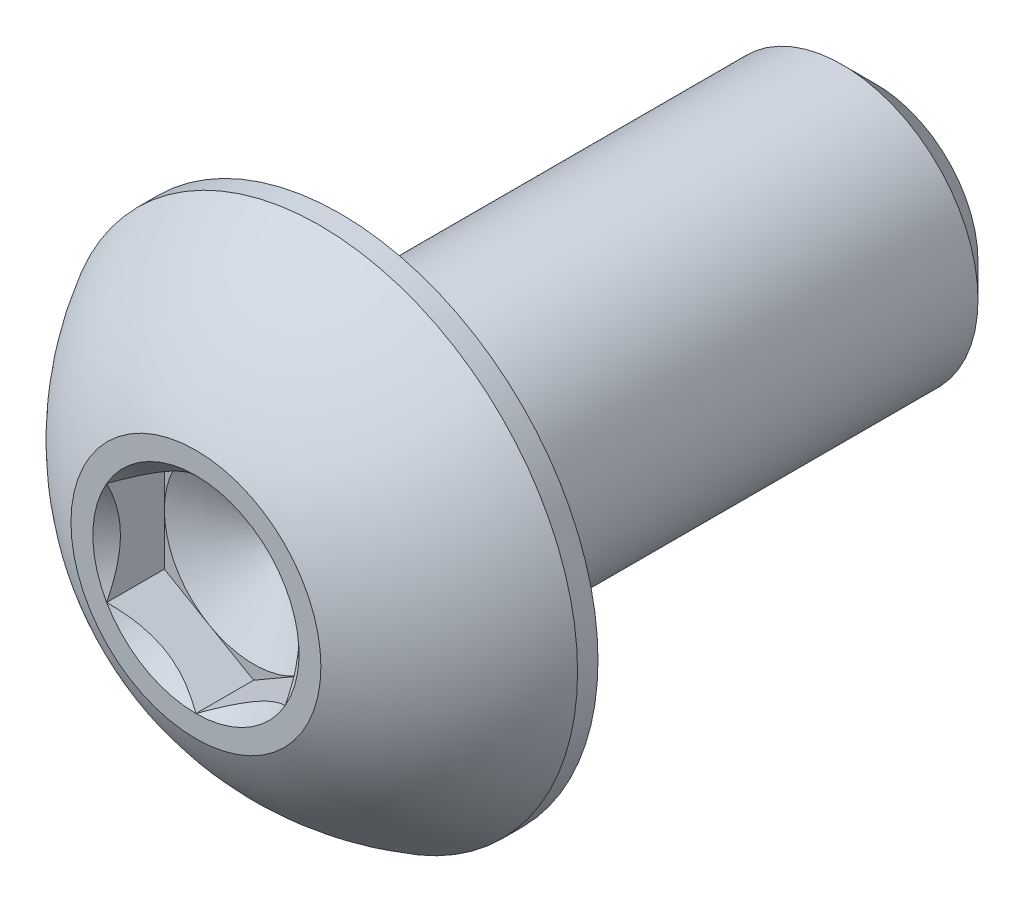
ISO-10303-21;
HEADER;
FILE_DESCRIPTION(('STEP AP214'),'2;1');
FILE_NAME('part.step','',(''),(''),'','','');
FILE_SCHEMA(('AUTOMOTIVE_DESIGN { 1 0 10303 214 1 1 1 1 }'));
ENDSEC;
DATA;
#1=APPLICATION_CONTEXT('core data for automotive mechanical design processes');
#2=APPLICATION_PROTOCOL_DEFINITION('international standard','automotive_design',2000,#1);
#3=PRODUCT_CONTEXT('',#1,'mechanical');
#4=PRODUCT('Part','Part','',(#3));
#5=PRODUCT_RELATED_PRODUCT_CATEGORY('part','',(#4));
#6=PRODUCT_DEFINITION_FORMATION('','',#4);
#7=PRODUCT_DEFINITION_CONTEXT('part definition',#1,'design');
#8=PRODUCT_DEFINITION('design','',#6,#7);
#9=PRODUCT_DEFINITION_SHAPE('','',#8);
#10=(LENGTH_UNIT() NAMED_UNIT(*) SI_UNIT(.MILLI.,.METRE.));
#11=(NAMED_UNIT(*) PLANE_ANGLE_UNIT() SI_UNIT($,.RADIAN.));
#12=(NAMED_UNIT(*) SI_UNIT($,.STERADIAN.) SOLID_ANGLE_UNIT());
#13=UNCERTAINTY_MEASURE_WITH_UNIT(LENGTH_MEASURE(1.E-05),#10,'distance_accuracy_value','');
#14=(GEOMETRIC_REPRESENTATION_CONTEXT(3) GLOBAL_UNCERTAINTY_ASSIGNED_CONTEXT((#13)) GLOBAL_UNIT_ASSIGNED_CONTEXT((#10,
#11,#12)) REPRESENTATION_CONTEXT('',''));
#15=CARTESIAN_POINT('',(0.,0.,0.));
#16=DIRECTION('',(0.,0.,1.));
#17=DIRECTION('',(1.,0.,0.));
#18=AXIS2_PLACEMENT_3D('',#15,#16,#17);
#19=CARTESIAN_POINT('',(0.,1.5875,6.0452));
#20=DIRECTION('',(0.,0.,-1.));
#21=DIRECTION('',(-1.,0.,0.));
#22=AXIS2_PLACEMENT_3D('',#19,#20,#21);
#23=PLANE('',#22);
#24=CARTESIAN_POINT('',(0.,0.,6.0452));
#25=DIRECTION('',(0.,0.,1.));
#26=DIRECTION('',(1.,0.,0.));
#27=AXIS2_PLACEMENT_3D('',#24,#25,#26);
#28=CIRCLE('',#27,2.2225);
#29=CARTESIAN_POINT('',(0.,2.2225,6.0452));
#30=VERTEX_POINT('',#29);
#31=EDGE_CURVE('E167',#30,#30,#28,.T.);
#32=ORIENTED_EDGE('',*,*,#31,.T.);
#33=EDGE_LOOP('',(#32));
#34=FACE_BOUND('',#33,.T.);
#35=CARTESIAN_POINT('',(0.,0.,6.0452));
#36=DIRECTION('',(0.,0.,1.));
#37=DIRECTION('',(1.,0.,0.));
#38=AXIS2_PLACEMENT_3D('',#35,#36,#37);
#39=CIRCLE('',#38,1.83308710467706);
#40=CARTESIAN_POINT('',(0.,1.83308710467706,6.0452));
#41=VERTEX_POINT('',#40);
#42=CARTESIAN_POINT('',(-1.5875,0.91654355233853,6.0452));
#43=VERTEX_POINT('',#42);
#44=EDGE_CURVE('E121',#41,#43,#39,.T.);
#45=ORIENTED_EDGE('',*,*,#44,.F.);
#46=CARTESIAN_POINT('',(0.,0.,6.0452));
#47=DIRECTION('',(0.,0.,1.));
#48=DIRECTION('',(1.,0.,0.));
#49=AXIS2_PLACEMENT_3D('',#46,#47,#48);
#50=CIRCLE('',#49,1.83308710467706);
#51=CARTESIAN_POINT('',(1.5875,0.916543552338531,6.0452));
#52=VERTEX_POINT('',#51);
#53=EDGE_CURVE('E106',#52,#41,#50,.T.);
#54=ORIENTED_EDGE('',*,*,#53,.F.);
#55=CARTESIAN_POINT('',(0.,0.,6.0452));
#56=DIRECTION('',(0.,0.,1.));
#57=DIRECTION('',(1.,0.,0.));
#58=AXIS2_PLACEMENT_3D('',#55,#56,#57);
#59=CIRCLE('',#58,1.83308710467706);
#60=CARTESIAN_POINT('',(1.5875,-0.916543552338529,6.0452));
#61=VERTEX_POINT('',#60);
#62=EDGE_CURVE('E117',#61,#52,#59,.T.);
#63=ORIENTED_EDGE('',*,*,#62,.F.);
#64=CARTESIAN_POINT('',(0.,0.,6.0452));
#65=DIRECTION('',(0.,0.,1.));
#66=DIRECTION('',(1.,0.,0.));
#67=AXIS2_PLACEMENT_3D('',#64,#65,#66);
#68=CIRCLE('',#67,1.83308710467706);
#69=CARTESIAN_POINT('',(0.,-1.83308710467706,6.0452));
#70=VERTEX_POINT('',#69);
#71=EDGE_CURVE('E138',#70,#61,#68,.T.);
#72=ORIENTED_EDGE('',*,*,#71,.F.);
#73=CARTESIAN_POINT('',(0.,0.,6.0452));
#74=DIRECTION('',(0.,0.,1.));
#75=DIRECTION('',(1.,0.,0.));
#76=AXIS2_PLACEMENT_3D('',#73,#74,#75);
#77=CIRCLE('',#76,1.83308710467706);
#78=CARTESIAN_POINT('',(-1.5875,-0.916543552338533,6.0452));
#79=VERTEX_POINT('',#78);
#80=EDGE_CURVE('E438',#79,#70,#77,.T.);
#81=ORIENTED_EDGE('',*,*,#80,.F.);
#82=CARTESIAN_POINT('',(0.,0.,6.0452));
#83=DIRECTION('',(0.,0.,1.));
#84=DIRECTION('',(1.,0.,0.));
#85=AXIS2_PLACEMENT_3D('',#82,#83,#84);
#86=CIRCLE('',#85,1.83308710467706);
#87=EDGE_CURVE('E447',#43,#79,#86,.T.);
#88=ORIENTED_EDGE('',*,*,#87,.F.);
#89=EDGE_LOOP('',(#45,#54,#63,#72,#81,#88));
#90=FACE_BOUND('',#89,.T.);
#91=ADVANCED_FACE('F33',(#34,#90),#23,.F.);
#92=CARTESIAN_POINT('',(0.,0.,-6.0452));
#93=DIRECTION('',(0.,0.,1.));
#94=DIRECTION('',(1.,0.,0.));
#95=AXIS2_PLACEMENT_3D('',#92,#93,#94);
#96=CONICAL_SURFACE('',#95,1.8176875,0.785398163397447);
#97=CARTESIAN_POINT('',(0.,0.,-5.4498875));
#98=DIRECTION('',(0.,0.,1.));
#99=DIRECTION('',(1.,0.,0.));
#100=AXIS2_PLACEMENT_3D('',#97,#98,#99);
#101=CIRCLE('',#100,2.413);
#102=CARTESIAN_POINT('',(2.413,0.,-5.4498875));
#103=VERTEX_POINT('',#102);
#104=EDGE_CURVE('E11',#103,#103,#101,.T.);
#105=ORIENTED_EDGE('',*,*,#104,.F.);
#106=EDGE_LOOP('',(#105));
#107=FACE_BOUND('',#106,.T.);
#108=CARTESIAN_POINT('',(0.,0.,-6.0452));
#109=DIRECTION('',(0.,0.,1.));
#110=DIRECTION('',(1.,0.,0.));
#111=AXIS2_PLACEMENT_3D('',#108,#109,#110);
#112=CIRCLE('',#111,1.8176875);
#113=CARTESIAN_POINT('',(1.8176875,0.,-6.0452));
#114=VERTEX_POINT('',#113);
#115=EDGE_CURVE('E160',#114,#114,#112,.T.);
#116=ORIENTED_EDGE('',*,*,#115,.T.);
#117=EDGE_LOOP('',(#116));
#118=FACE_BOUND('',#117,.T.);
#119=ADVANCED_FACE('F35',(#107,#118),#96,.T.);
#120=CARTESIAN_POINT('',(0.,0.,6.0452));
#121=DIRECTION('',(0.,0.,1.));
#122=DIRECTION('',(1.,0.,0.));
#123=AXIS2_PLACEMENT_3D('',#120,#121,#122);
#124=CYLINDRICAL_SURFACE('',#123,2.413);
#125=CARTESIAN_POINT('',(0.,0.,3.4798));
#126=DIRECTION('',(0.,0.,1.));
#127=DIRECTION('',(1.,0.,0.));
#128=AXIS2_PLACEMENT_3D('',#125,#126,#127);
#129=CIRCLE('',#128,2.413);
#130=CARTESIAN_POINT('',(2.413,0.,3.4798));
#131=VERTEX_POINT('',#130);
#132=EDGE_CURVE('E41',#131,#131,#129,.T.);
#133=ORIENTED_EDGE('',*,*,#132,.F.);
#134=EDGE_LOOP('',(#133));
#135=FACE_BOUND('',#134,.T.);
#136=ORIENTED_EDGE('',*,*,#104,.T.);
#137=EDGE_LOOP('',(#136));
#138=FACE_BOUND('',#137,.T.);
#139=ADVANCED_FACE('F181',(#135,#138),#124,.T.);
#140=CARTESIAN_POINT('',(0.,4.5847,3.4798));
#141=DIRECTION('',(0.,0.,1.));
#142=DIRECTION('',(1.,0.,0.));
#143=AXIS2_PLACEMENT_3D('',#140,#141,#142);
#144=PLANE('',#143);
#145=CARTESIAN_POINT('',(0.,0.,3.4798));
#146=DIRECTION('',(0.,0.,1.));
#147=DIRECTION('',(1.,0.,0.));
#148=AXIS2_PLACEMENT_3D('',#145,#146,#147);
#149=CIRCLE('',#148,4.5847);
#150=CARTESIAN_POINT('',(4.5847,0.,3.4798));
#151=VERTEX_POINT('',#150);
#152=EDGE_CURVE('E174',#151,#151,#149,.T.);
#153=ORIENTED_EDGE('',*,*,#152,.F.);
#154=EDGE_LOOP('',(#153));
#155=FACE_BOUND('',#154,.T.);
#156=ORIENTED_EDGE('',*,*,#132,.T.);
#157=EDGE_LOOP('',(#156));
#158=FACE_BOUND('',#157,.T.);
#159=ADVANCED_FACE('F179',(#155,#158),#144,.F.);
#160=CARTESIAN_POINT('',(0.,0.,6.0452));
#161=DIRECTION('',(0.,0.,1.));
#162=DIRECTION('',(1.,0.,0.));
#163=AXIS2_PLACEMENT_3D('',#160,#161,#162);
#164=CYLINDRICAL_SURFACE('',#163,4.5847);
#165=CARTESIAN_POINT('',(0.,0.,3.84265714285714));
#166=DIRECTION('',(0.,0.,1.));
#167=DIRECTION('',(1.,0.,0.));
#168=AXIS2_PLACEMENT_3D('',#165,#166,#167);
#169=CIRCLE('',#168,4.5847);
#170=CARTESIAN_POINT('',(0.,4.5847,3.84265714285714));
#171=VERTEX_POINT('',#170);
#172=EDGE_CURVE('E171',#171,#171,#169,.T.);
#173=ORIENTED_EDGE('',*,*,#172,.F.);
#174=EDGE_LOOP('',(#173));
#175=FACE_BOUND('',#174,.T.);
#176=ORIENTED_EDGE('',*,*,#152,.T.);
#177=EDGE_LOOP('',(#176));
#178=FACE_BOUND('',#177,.T.);
#179=ADVANCED_FACE('F200',(#175,#178),#164,.T.);
#180=CARTESIAN_POINT('',(0.,0.,1.29360962579431));
#181=DIRECTION('',(0.,0.,1.));
#182=DIRECTION('',(0.,1.,0.));
#183=AXIS2_PLACEMENT_3D('',#180,#181,#182);
#184=SPHERICAL_SURFACE('',#183,5.24567606074224);
#185=CARTESIAN_POINT('',(0.,2.2225,6.0452));
#186=CARTESIAN_POINT('',(0.,2.2534773813734,6.03071074824653));
#187=CARTESIAN_POINT('',(0.,2.28431303158804,6.01591848625839));
#188=CARTESIAN_POINT('',(0.,2.34568916388881,5.98573378101716));
#189=CARTESIAN_POINT('',(0.,2.37622964597494,5.97034133776408));
#190=CARTESIAN_POINT('',(0.,2.43700373620763,5.93896210919738));
#191=CARTESIAN_POINT('',(0.,2.46723734435421,5.92297532388377));
#192=CARTESIAN_POINT('',(0.,2.52738612853076,5.89041353925456));
#193=CARTESIAN_POINT('',(0.,2.55730130456073,5.87383853993896));
#194=CARTESIAN_POINT('',(0.,2.61680178002346,5.84010666387771));
#195=CARTESIAN_POINT('',(0.,2.6463870794562,5.82294978713206));
#196=CARTESIAN_POINT('',(0.,2.70521648559601,5.78806071977142));
#197=CARTESIAN_POINT('',(0.,2.73446059230307,5.77032852915643));
#198=CARTESIAN_POINT('',(0.,2.79259642678969,5.73429561649605));
#199=CARTESIAN_POINT('',(0.,2.82148815456926,5.71599489445066));
#200=CARTESIAN_POINT('',(0.,2.87890817994247,5.67883191915285));
#201=CARTESIAN_POINT('',(0.,2.90743647753613,5.65996966590042));
#202=CARTESIAN_POINT('',(0.,2.96411873025195,5.62169084311661));
#203=CARTESIAN_POINT('',(0.,2.99227268537412,5.60227427358522));
#204=CARTESIAN_POINT('',(0.,3.04819548406127,5.56289424522424));
#205=CARTESIAN_POINT('',(0.,3.07596432762624,5.54293078639465));
#206=CARTESIAN_POINT('',(0.,3.13110628141819,5.50246461560096));
#207=CARTESIAN_POINT('',(0.,3.15847939164515,5.48196190363687));
#208=CARTESIAN_POINT('',(0.,3.2128194083519,5.44042506900768));
#209=CARTESIAN_POINT('',(0.,3.23978631483168,5.41939094634259));
#210=CARTESIAN_POINT('',(0.,3.29330360901047,5.37679933601284));
#211=CARTESIAN_POINT('',(0.,3.31985399670949,5.35524184834818));
#212=CARTESIAN_POINT('',(0.,3.37252809761461,5.31161175391169));
#213=CARTESIAN_POINT('',(0.,3.39865181082073,5.28953914713985));
#214=CARTESIAN_POINT('',(0.,3.45046257023396,5.24488725741808));
#215=CARTESIAN_POINT('',(0.,3.47614961644107,5.22230797446814));
#216=CARTESIAN_POINT('',(0.,3.5270772163784,5.17665136912649));
#217=CARTESIAN_POINT('',(0.,3.55231777010863,5.15357404673478));
#218=CARTESIAN_POINT('',(0.,3.60234273040088,5.10693018974953));
#219=CARTESIAN_POINT('',(0.,3.6271271369629,5.083363655156));
#220=CARTESIAN_POINT('',(0.,3.67623032270693,5.03575038813422));
#221=CARTESIAN_POINT('',(0.,3.70054910188895,5.01170365570597));
#222=CARTESIAN_POINT('',(0.,3.74871173076698,4.96313919106094));
#223=CARTESIAN_POINT('',(0.,3.77255558046298,4.93862145884416));
#224=CARTESIAN_POINT('',(0.,3.8197592299269,4.88912437282903));
#225=CARTESIAN_POINT('',(0.,3.8431190296948,4.86414501903068));
#226=CARTESIAN_POINT('',(0.,3.88934564401292,4.8137342446329));
#227=CARTESIAN_POINT('',(0.,3.91221245856313,4.78830282403346));
#228=CARTESIAN_POINT('',(0.,3.95744435572676,4.73699764373282));
#229=CARTESIAN_POINT('',(0.,3.97980943834017,4.71112388403161));
#230=CARTESIAN_POINT('',(0.,4.02402931682667,4.65894392242435));
#231=CARTESIAN_POINT('',(0.,4.04588411269977,4.6326377205183));
#232=CARTESIAN_POINT('',(0.,4.08907505809202,4.57960293681139));
#233=CARTESIAN_POINT('',(0.,4.11041120761118,4.55287435501054));
#234=CARTESIAN_POINT('',(0.,4.15255669906197,4.49900503538401));
#235=CARTESIAN_POINT('',(0.,4.17336604099361,4.47186429755832));
#236=CARTESIAN_POINT('',(0.,4.21444995756537,4.41718104741742));
#237=CARTESIAN_POINT('',(0.,4.23472453220548,4.38963853510221));
#238=CARTESIAN_POINT('',(0.,4.27473115896065,4.33416227115159));
#239=CARTESIAN_POINT('',(0.,4.2944632110757,4.30622851951617));
#240=CARTESIAN_POINT('',(0.,4.33337724537132,4.24998046192396));
#241=CARTESIAN_POINT('',(0.,4.3525592275519,4.22166615596717));
#242=CARTESIAN_POINT('',(0.,4.39036578383499,4.16466781963255));
#243=CARTESIAN_POINT('',(0.,4.40899035793751,4.13598378925471));
#244=CARTESIAN_POINT('',(0.,4.44567497738742,4.07825697787584));
#245=CARTESIAN_POINT('',(0.,4.46373502273481,4.0492141968748));
#246=CARTESIAN_POINT('',(0.,4.49928366405765,3.99078098603411));
#247=CARTESIAN_POINT('',(0.,4.5167722600331,3.96139055619445));
#248=CARTESIAN_POINT('',(0.,4.55117135982878,3.90227331691564));
#249=CARTESIAN_POINT('',(0.,4.56808186364901,3.87254650747649));
#250=CARTESIAN_POINT('',(0.,4.5847,3.84265714285714));
#251=B_SPLINE_CURVE_WITH_KNOTS('',3,(#185,#186,#187,#188,#189,#190,#191,#192,#193,#194,#195,
#196,#197,#198,#199,#200,#201,#202,#203,#204,#205,#206,#207,#208,#209,#210,#211,#212,#213,#214,
#215,#216,#217,#218,#219,#220,#221,#222,#223,#224,#225,#226,#227,#228,#229,#230,#231,#232,#233,
#234,#235,#236,#237,#238,#239,#240,#241,#242,#243,#244,#245,#246,#247,#248,#249,#250),
.UNSPECIFIED.,.F.,.F.,(4,2,2,2,2,2,2,2,2,2,2,2,2,2,2,2,2,2,2,2,2,2,2,2,2,2,2,2,2,2,2,2,4),(0.,
0.102593825831514,0.205187651663027,0.307781477494541,0.410375303326055,0.512969129157569,
0.615562954989083,0.718156780820597,0.820750606652111,0.923344432483624,1.02593825831514,
1.12853208414665,1.23112590997817,1.33371973580968,1.43631356164119,1.53890738747271,
1.64150121330422,1.74409503913573,1.84668886496725,1.94928269079876,2.05187651663028,
2.15447034246179,2.2570641682933,2.35965799412482,2.46225181995633,2.56484564578784,
2.66743947161936,2.77003329745087,2.87262712328239,2.9752209491139,3.07781477494541,
3.18040860077693,3.28300242660844),.UNSPECIFIED.);
#252=EDGE_CURVE('BSEAM192',#30,#171,#251,.T.);
#253=ORIENTED_EDGE('',*,*,#31,.F.);
#254=ORIENTED_EDGE('',*,*,#172,.T.);
#255=ORIENTED_EDGE('',*,*,#252,.T.);
#256=ORIENTED_EDGE('',*,*,#252,.F.);
#257=EDGE_LOOP('',(#253,#255,#254,#256));
#258=FACE_BOUND('',#257,.T.);
#259=ADVANCED_FACE('F192',(#258),#184,.T.);
#260=CARTESIAN_POINT('',(0.,1.8176875,-6.0452));
#261=DIRECTION('',(0.,0.,1.));
#262=DIRECTION('',(1.,0.,0.));
#263=AXIS2_PLACEMENT_3D('',#260,#261,#262);
#264=PLANE('',#263);
#265=ORIENTED_EDGE('',*,*,#115,.F.);
#266=EDGE_LOOP('',(#265));
#267=FACE_BOUND('',#266,.T.);
#268=ADVANCED_FACE('F190',(#267),#264,.F.);
#269=CARTESIAN_POINT('',(1.5875,0.916543552338531,6.0452));
#270=DIRECTION('',(-0.5,-0.866025403784439,0.));
#271=DIRECTION('',(0.866025403784439,-0.5,0.));
#272=AXIS2_PLACEMENT_3D('',#269,#270,#271);
#273=PLANE('',#272);
#274=CARTESIAN_POINT('',(1.5877,0.916428082284693,6.04531548096371));
#275=CARTESIAN_POINT('',(1.53312479190086,0.947937093371809,6.0138308083706));
#276=CARTESIAN_POINT('',(1.47763696320971,0.979973006203395,5.98419504601353));
#277=CARTESIAN_POINT('',(1.36449087915364,1.04529792829092,5.92993226002083));
#278=CARTESIAN_POINT('',(1.30682185887062,1.07859315267522,5.90533543513318));
#279=CARTESIAN_POINT('',(1.1905349781269,1.14573141457583,5.86320036427258));
#280=CARTESIAN_POINT('',(1.13194674474407,1.17955734689075,5.84555619272982));
#281=CARTESIAN_POINT('',(1.01348022674557,1.24795402294714,5.81837147008497));
#282=CARTESIAN_POINT('',(0.953605562983895,1.28252267618759,5.80881062069508));
#283=CARTESIAN_POINT('',(0.850418771876557,1.34209759781022,5.80018441310401));
#284=CARTESIAN_POINT('',(0.807240015952287,1.36702686416637,5.79890719280958));
#285=CARTESIAN_POINT('',(0.720953038535398,1.41684467380557,5.8010570558147));
#286=CARTESIAN_POINT('',(0.677844847078612,1.44173319974742,5.80448578854934));
#287=CARTESIAN_POINT('',(0.59204633500203,1.49126899379091,5.81585099443334));
#288=CARTESIAN_POINT('',(0.549356408925406,1.51591603410293,5.82379137180164));
#289=CARTESIAN_POINT('',(0.464693063478358,1.56479643938728,5.8437484144511));
#290=CARTESIAN_POINT('',(0.422719959755074,1.58902962212064,5.85576682920869));
#291=CARTESIAN_POINT('',(0.315211458113566,1.65109968448354,5.89144689724725));
#292=CARTESIAN_POINT('',(0.2503427717089,1.68855163804125,5.91779857230314));
#293=CARTESIAN_POINT('',(0.154961599380923,1.74361998356043,5.9622835368517));
#294=CARTESIAN_POINT('',(0.123530699536156,1.76176662204668,5.97791285780113));
#295=CARTESIAN_POINT('',(0.0612469855696359,1.79772614107138,6.0105984878611));
#296=CARTESIAN_POINT('',(0.0303939039605753,1.8155391760437,6.02765411565697));
#297=CARTESIAN_POINT('',(-0.00020000000000146,1.8332025747309,6.04531548096371));
#298=B_SPLINE_CURVE_WITH_KNOTS('',3,(#274,#275,#276,#277,#278,#279,#280,#281,#282,#283,#284,
#285,#286,#287,#288,#289,#290,#291,#292,#293,#294,#295,#296,#297),.UNSPECIFIED.,.F.,.F.,(4,2,2,
2,2,2,2,2,2,2,2,4),(0.,0.211482650810816,0.424197870807276,0.633533884524816,0.842342653263348,
0.991755553727141,1.14122083674204,1.29081565918877,1.44047473906438,1.6781878086972,
1.79671410024894,1.91518409436631),.UNSPECIFIED.);
#299=EDGE_CURVE('E103',#52,#41,#298,.T.);
#300=ORIENTED_EDGE('',*,*,#299,.T.);
#301=DIRECTION('',(0.,0.,-1.));
#302=VECTOR('',#301,1.);
#303=CARTESIAN_POINT('',(0.,1.83308710467706,6.0452));
#304=LINE('',#303,#302);
#305=CARTESIAN_POINT('',(0.,1.83308710467706,5.01904));
#306=VERTEX_POINT('',#305);
#307=EDGE_CURVE('E158',#41,#306,#304,.T.);
#308=ORIENTED_EDGE('',*,*,#307,.T.);
#309=DIRECTION('',(-0.866025403784439,0.499999999999999,0.));
#310=VECTOR('',#309,1.);
#311=CARTESIAN_POINT('',(1.5875,0.916543552338531,5.01904));
#312=LINE('',#311,#310);
#313=CARTESIAN_POINT('',(0.793749999999999,1.3748153285078,5.01904));
#314=VERTEX_POINT('',#313);
#315=EDGE_CURVE('E474',#314,#306,#312,.T.);
#316=ORIENTED_EDGE('',*,*,#315,.F.);
#317=CARTESIAN_POINT('',(1.5875,0.916543552338531,5.01904));
#318=VERTEX_POINT('',#317);
#319=EDGE_CURVE('E48',#318,#314,#312,.T.);
#320=ORIENTED_EDGE('',*,*,#319,.F.);
#321=DIRECTION('',(0.,0.,-1.));
#322=VECTOR('',#321,1.);
#323=CARTESIAN_POINT('',(1.5875,0.916543552338531,6.0452));
#324=LINE('',#323,#322);
#325=EDGE_CURVE('E134',#52,#318,#324,.T.);
#326=ORIENTED_EDGE('',*,*,#325,.F.);
#327=EDGE_LOOP('',(#300,#308,#316,#320,#326));
#328=FACE_BOUND('',#327,.T.);
#329=ADVANCED_FACE('F140',(#328),#273,.T.);
#330=CARTESIAN_POINT('',(0.,1.83308710467706,6.0452));
#331=DIRECTION('',(0.5,-0.866025403784438,0.));
#332=DIRECTION('',(0.866025403784438,0.5,0.));
#333=AXIS2_PLACEMENT_3D('',#330,#331,#332);
#334=PLANE('',#333);
#335=CARTESIAN_POINT('',(0.000199999999998467,1.8332025747309,6.04531548096371));
#336=CARTESIAN_POINT('',(-0.0543752080991377,1.80169356364378,6.0138308083706));
#337=CARTESIAN_POINT('',(-0.109863036790291,1.7696576508122,5.98419504601353));
#338=CARTESIAN_POINT('',(-0.22300912084636,1.70433272872467,5.92993226002083));
#339=CARTESIAN_POINT('',(-0.280678141129382,1.67103750434037,5.90533543513318));
#340=CARTESIAN_POINT('',(-0.396965021873103,1.60389924243976,5.86320036427258));
#341=CARTESIAN_POINT('',(-0.455553255255931,1.57007331012484,5.84555619272982));
#342=CARTESIAN_POINT('',(-0.574019773254431,1.50167663406845,5.81837147008497));
#343=CARTESIAN_POINT('',(-0.633894437016105,1.46710798082801,5.80881062069508));
#344=CARTESIAN_POINT('',(-0.737081228123442,1.40753305920537,5.80018441310401));
#345=CARTESIAN_POINT('',(-0.780259984047712,1.38260379284922,5.79890719280958));
#346=CARTESIAN_POINT('',(-0.866546961464601,1.33278598321002,5.8010570558147));
#347=CARTESIAN_POINT('',(-0.909655152921388,1.30789745726817,5.80448578854934));
#348=CARTESIAN_POINT('',(-0.995453664997969,1.25836166322468,5.81585099443334));
#349=CARTESIAN_POINT('',(-1.03814359107459,1.23371462291266,5.82379137180164));
#350=CARTESIAN_POINT('',(-1.12280693652164,1.18483421762831,5.8437484144511));
#351=CARTESIAN_POINT('',(-1.16478004024492,1.16060103489495,5.85576682920869));
#352=CARTESIAN_POINT('',(-1.27228854188643,1.09853097253205,5.89144689724725));
#353=CARTESIAN_POINT('',(-1.3371572282911,1.06107901897434,5.91779857230314));
#354=CARTESIAN_POINT('',(-1.43253840061908,1.00601067345516,5.9622835368517));
#355=CARTESIAN_POINT('',(-1.46396930046384,0.987864034968914,5.97791285780113));
#356=CARTESIAN_POINT('',(-1.52625301443036,0.951904515944214,6.0105984878611));
#357=CARTESIAN_POINT('',(-1.55710609603942,0.934091480971893,6.02765411565697));
#358=CARTESIAN_POINT('',(-1.5877,0.916428082284692,6.04531548096371));
#359=B_SPLINE_CURVE_WITH_KNOTS('',3,(#335,#336,#337,#338,#339,#340,#341,#342,#343,#344,#345,
#346,#347,#348,#349,#350,#351,#352,#353,#354,#355,#356,#357,#358),.UNSPECIFIED.,.F.,.F.,(4,2,2,
2,2,2,2,2,2,2,2,4),(0.,0.211482650810816,0.424197870807274,0.633533884524814,0.842342653263346,
0.991755553727139,1.14122083674204,1.29081565918877,1.44047473906437,1.6781878086972,
1.79671410024894,1.91518409436631),.UNSPECIFIED.);
#360=EDGE_CURVE('E462',#41,#43,#359,.T.);
#361=ORIENTED_EDGE('',*,*,#360,.T.);
#362=DIRECTION('',(0.,0.,-1.));
#363=VECTOR('',#362,1.);
#364=CARTESIAN_POINT('',(-1.5875,0.91654355233853,6.0452));
#365=LINE('',#364,#363);
#366=CARTESIAN_POINT('',(-1.5875,0.91654355233853,5.01904));
#367=VERTEX_POINT('',#366);
#368=EDGE_CURVE('E155',#43,#367,#365,.T.);
#369=ORIENTED_EDGE('',*,*,#368,.T.);
#370=DIRECTION('',(-0.866025403784438,-0.5,0.));
#371=VECTOR('',#370,1.);
#372=CARTESIAN_POINT('',(0.,1.83308710467706,5.01904));
#373=LINE('',#372,#371);
#374=CARTESIAN_POINT('',(-0.793750000000001,1.3748153285078,5.01904));
#375=VERTEX_POINT('',#374);
#376=EDGE_CURVE('E476',#375,#367,#373,.T.);
#377=ORIENTED_EDGE('',*,*,#376,.F.);
#378=EDGE_CURVE('E477',#306,#375,#373,.T.);
#379=ORIENTED_EDGE('',*,*,#378,.F.);
#380=ORIENTED_EDGE('',*,*,#307,.F.);
#381=EDGE_LOOP('',(#361,#369,#377,#379,#380));
#382=FACE_BOUND('',#381,.T.);
#383=ADVANCED_FACE('F198',(#382),#334,.T.);
#384=CARTESIAN_POINT('',(-1.5875,0.91654355233853,6.0452));
#385=DIRECTION('',(1.,0.,0.));
#386=DIRECTION('',(0.,1.,0.));
#387=AXIS2_PLACEMENT_3D('',#384,#385,#386);
#388=PLANE('',#387);
#389=CARTESIAN_POINT('',(-1.5875,-1.8064504268921,6.61698698658398));
#390=CARTESIAN_POINT('',(-1.5875,-1.76236619947005,6.58387765189215));
#391=CARTESIAN_POINT('',(-1.5875,-1.7180340172246,6.55109936728741));
#392=CARTESIAN_POINT('',(-1.5875,-1.62877387436181,6.48634092729782));
#393=CARTESIAN_POINT('',(-1.5875,-1.58384576476286,6.45436097748322));
#394=CARTESIAN_POINT('',(-1.5875,-1.44736053267712,6.35936696154791));
#395=CARTESIAN_POINT('',(-1.5875,-1.3547728804759,6.29780882424476));
#396=CARTESIAN_POINT('',(-1.5875,-1.16075761948671,6.17715751972008));
#397=CARTESIAN_POINT('',(-1.5875,-1.05912459725148,6.11839084409804));
#398=CARTESIAN_POINT('',(-1.5875,-0.850810108093356,6.01103067812025));
#399=CARTESIAN_POINT('',(-1.5875,-0.744147188151383,5.9624029254242));
#400=CARTESIAN_POINT('',(-1.5875,-0.583837187923044,5.90291807950615));
#401=CARTESIAN_POINT('',(-1.5875,-0.532518160842357,5.88581011476258));
#402=CARTESIAN_POINT('',(-1.5875,-0.428659985513865,5.85571705307571));
#403=CARTESIAN_POINT('',(-1.5875,-0.37612075167657,5.84273224628788));
#404=CARTESIAN_POINT('',(-1.5875,-0.271003698108568,5.82177039746268));
#405=CARTESIAN_POINT('',(-1.5875,-0.218442994151922,5.81370885122062));
#406=CARTESIAN_POINT('',(-1.5875,-0.112783135871372,5.80274746810392));
#407=CARTESIAN_POINT('',(-1.5875,-0.0596840710482698,5.79984678695656));
#408=CARTESIAN_POINT('',(-1.5875,0.0447055832560293,5.79941381931861));
#409=CARTESIAN_POINT('',(-1.5875,0.0959954901561847,5.80170012793679));
#410=CARTESIAN_POINT('',(-1.5875,0.198125185705279,5.81111970580147));
#411=CARTESIAN_POINT('',(-1.5875,0.248964929488491,5.81825345278263));
#412=CARTESIAN_POINT('',(-1.5875,0.350686556652122,5.83710310969938));
#413=CARTESIAN_POINT('',(-1.5875,0.401553911407877,5.84889626149498));
#414=CARTESIAN_POINT('',(-1.5875,0.502179810539459,5.87644443755636));
#415=CARTESIAN_POINT('',(-1.5875,0.551938454553038,5.89219910423225));
#416=CARTESIAN_POINT('',(-1.5875,0.709597941546692,5.94801737605639));
#417=CARTESIAN_POINT('',(-1.5875,0.815228306930166,5.99447915633839));
#418=CARTESIAN_POINT('',(-1.5875,1.02151735170486,6.09775145508529));
#419=CARTESIAN_POINT('',(-1.5875,1.12215634479547,6.15459935808162));
#420=CARTESIAN_POINT('',(-1.5875,1.31447644029508,6.27184912470739));
#421=CARTESIAN_POINT('',(-1.5875,1.40635401847359,6.33193268451341));
#422=CARTESIAN_POINT('',(-1.5875,1.54171769329396,6.42480190804474));
#423=CARTESIAN_POINT('',(-1.5875,1.58625419266992,6.45608312786969));
#424=CARTESIAN_POINT('',(-1.5875,1.67471932537719,6.51946920360769));
#425=CARTESIAN_POINT('',(-1.5875,1.71864812234279,6.55157383088692));
#426=CARTESIAN_POINT('',(-1.5875,1.76232404534813,6.58401978447609));
#427=B_SPLINE_CURVE_WITH_KNOTS('',3,(#389,#390,#391,#392,#393,#394,#395,#396,#397,#398,#399,
#400,#401,#402,#403,#404,#405,#406,#407,#408,#409,#410,#411,#412,#413,#414,#415,#416,#417,#418,
#419,#420,#421,#422,#423,#424,#425,#426),.UNSPECIFIED.,.F.,.F.,(4,2,2,2,2,2,2,2,2,2,2,2,2,2,2,2,
2,2,4),(0.,0.16539472061177,0.330831599805601,0.664230904656281,1.01613642769877,
1.36683276443451,1.5289815746679,1.69114179313303,1.85043410106595,2.00970034776347,
2.16348276168557,2.31728033368487,2.47374234648083,2.63019024115108,2.97536284656899,
3.32180328575217,3.65097853196649,3.8142455159316,3.97746764647571),.UNSPECIFIED.);
#428=EDGE_CURVE('E455',#43,#79,#427,.F.);
#429=ORIENTED_EDGE('',*,*,#428,.T.);
#430=DIRECTION('',(0.,0.,-1.));
#431=VECTOR('',#430,1.);
#432=CARTESIAN_POINT('',(-1.5875,-0.916543552338532,6.0452));
#433=LINE('',#432,#431);
#434=CARTESIAN_POINT('',(-1.5875,-0.916543552338532,5.01904));
#435=VERTEX_POINT('',#434);
#436=EDGE_CURVE('E152',#79,#435,#433,.T.);
#437=ORIENTED_EDGE('',*,*,#436,.T.);
#438=DIRECTION('',(0.,-1.,0.));
#439=VECTOR('',#438,1.);
#440=CARTESIAN_POINT('',(-1.5875,0.91654355233853,5.01904));
#441=LINE('',#440,#439);
#442=CARTESIAN_POINT('',(-1.5875,0.,5.01904));
#443=VERTEX_POINT('',#442);
#444=EDGE_CURVE('E480',#443,#435,#441,.T.);
#445=ORIENTED_EDGE('',*,*,#444,.F.);
#446=EDGE_CURVE('E481',#367,#443,#441,.T.);
#447=ORIENTED_EDGE('',*,*,#446,.F.);
#448=ORIENTED_EDGE('',*,*,#368,.F.);
#449=EDGE_LOOP('',(#429,#437,#445,#447,#448));
#450=FACE_BOUND('',#449,.T.);
#451=ADVANCED_FACE('F319',(#450),#388,.T.);
#452=CARTESIAN_POINT('',(-1.5875,-0.916543552338532,6.0452));
#453=DIRECTION('',(0.499999999999999,0.866025403784439,0.));
#454=DIRECTION('',(-0.866025403784439,0.5,0.));
#455=AXIS2_PLACEMENT_3D('',#452,#453,#454);
#456=PLANE('',#455);
#457=CARTESIAN_POINT('',(-1.5877,-0.916428082284694,6.04531548096371));
#458=CARTESIAN_POINT('',(-1.53312479190086,-0.94793709337181,6.0138308083706));
#459=CARTESIAN_POINT('',(-1.47763696320971,-0.979973006203396,5.98419504601353));
#460=CARTESIAN_POINT('',(-1.36449087915364,-1.04529792829092,5.92993226002083));
#461=CARTESIAN_POINT('',(-1.30682185887062,-1.07859315267522,5.90533543513318));
#462=CARTESIAN_POINT('',(-1.1905349781269,-1.14573141457583,5.86320036427258));
#463=CARTESIAN_POINT('',(-1.13194674474407,-1.17955734689075,5.84555619272982));
#464=CARTESIAN_POINT('',(-1.01348022674557,-1.24795402294715,5.81837147008497));
#465=CARTESIAN_POINT('',(-0.953605562983893,-1.28252267618759,5.80881062069508));
#466=CARTESIAN_POINT('',(-0.850418771876556,-1.34209759781022,5.80018441310401));
#467=CARTESIAN_POINT('',(-0.807240015952286,-1.36702686416637,5.79890719280958));
#468=CARTESIAN_POINT('',(-0.720953038535396,-1.41684467380557,5.8010570558147));
#469=CARTESIAN_POINT('',(-0.67784484707861,-1.44173319974743,5.80448578854934));
#470=CARTESIAN_POINT('',(-0.592046335002028,-1.49126899379091,5.81585099443334));
#471=CARTESIAN_POINT('',(-0.549356408925404,-1.51591603410293,5.82379137180164));
#472=CARTESIAN_POINT('',(-0.464693063478356,-1.56479643938728,5.8437484144511));
#473=CARTESIAN_POINT('',(-0.422719959755072,-1.58902962212064,5.85576682920869));
#474=CARTESIAN_POINT('',(-0.315211458113564,-1.65109968448354,5.89144689724725));
#475=CARTESIAN_POINT('',(-0.250342771708898,-1.68855163804125,5.91779857230314));
#476=CARTESIAN_POINT('',(-0.154961599380923,-1.74361998356043,5.9622835368517));
#477=CARTESIAN_POINT('',(-0.123530699536156,-1.76176662204668,5.97791285780113));
#478=CARTESIAN_POINT('',(-0.0612469855696361,-1.79772614107138,6.0105984878611));
#479=CARTESIAN_POINT('',(-0.0303939039605757,-1.8155391760437,6.02765411565697));
#480=CARTESIAN_POINT('',(0.000200000000000947,-1.8332025747309,6.04531548096371));
#481=B_SPLINE_CURVE_WITH_KNOTS('',3,(#457,#458,#459,#460,#461,#462,#463,#464,#465,#466,#467,
#468,#469,#470,#471,#472,#473,#474,#475,#476,#477,#478,#479,#480),.UNSPECIFIED.,.F.,.F.,(4,2,2,
2,2,2,2,2,2,2,2,4),(0.,0.211482650810817,0.424197870807277,0.633533884524817,0.84234265326335,
0.991755553727143,1.14122083674205,1.29081565918877,1.44047473906438,1.6781878086972,
1.79671410024894,1.91518409436631),.UNSPECIFIED.);
#482=EDGE_CURVE('E440',#79,#70,#481,.T.);
#483=ORIENTED_EDGE('',*,*,#482,.T.);
#484=DIRECTION('',(0.,0.,-1.));
#485=VECTOR('',#484,1.);
#486=CARTESIAN_POINT('',(0.,-1.83308710467706,6.0452));
#487=LINE('',#486,#485);
#488=CARTESIAN_POINT('',(0.,-1.83308710467706,5.01904));
#489=VERTEX_POINT('',#488);
#490=EDGE_CURVE('E143',#70,#489,#487,.T.);
#491=ORIENTED_EDGE('',*,*,#490,.T.);
#492=DIRECTION('',(0.866025403784439,-0.499999999999999,0.));
#493=VECTOR('',#492,1.);
#494=CARTESIAN_POINT('',(-1.5875,-0.916543552338532,5.01904));
#495=LINE('',#494,#493);
#496=CARTESIAN_POINT('',(-0.793749999999999,-1.3748153285078,5.01904));
#497=VERTEX_POINT('',#496);
#498=EDGE_CURVE('E484',#497,#489,#495,.T.);
#499=ORIENTED_EDGE('',*,*,#498,.F.);
#500=EDGE_CURVE('E485',#435,#497,#495,.T.);
#501=ORIENTED_EDGE('',*,*,#500,.F.);
#502=ORIENTED_EDGE('',*,*,#436,.F.);
#503=EDGE_LOOP('',(#483,#491,#499,#501,#502));
#504=FACE_BOUND('',#503,.T.);
#505=ADVANCED_FACE('F329',(#504),#456,.T.);
#506=CARTESIAN_POINT('',(0.,-1.83308710467706,6.0452));
#507=DIRECTION('',(-0.5,0.866025403784439,0.));
#508=DIRECTION('',(-0.866025403784438,-0.5,0.));
#509=AXIS2_PLACEMENT_3D('',#506,#507,#508);
#510=PLANE('',#509);
#511=CARTESIAN_POINT('',(-0.000199999999998927,-1.8332025747309,6.04531548096371));
#512=CARTESIAN_POINT('',(0.0543752080991374,-1.80169356364378,6.0138308083706));
#513=CARTESIAN_POINT('',(0.109863036790291,-1.7696576508122,5.98419504601353));
#514=CARTESIAN_POINT('',(0.22300912084636,-1.70433272872467,5.92993226002083));
#515=CARTESIAN_POINT('',(0.280678141129382,-1.67103750434037,5.90533543513318));
#516=CARTESIAN_POINT('',(0.396965021873104,-1.60389924243976,5.86320036427258));
#517=CARTESIAN_POINT('',(0.455553255255932,-1.57007331012484,5.84555619272982));
#518=CARTESIAN_POINT('',(0.574019773254432,-1.50167663406845,5.81837147008497));
#519=CARTESIAN_POINT('',(0.633894437016106,-1.46710798082801,5.80881062069508));
#520=CARTESIAN_POINT('',(0.737081228123443,-1.40753305920537,5.80018441310401));
#521=CARTESIAN_POINT('',(0.780259984047713,-1.38260379284922,5.79890719280958));
#522=CARTESIAN_POINT('',(0.866546961464602,-1.33278598321002,5.80105705581471));
#523=CARTESIAN_POINT('',(0.909655152921389,-1.30789745726817,5.80448578854935));
#524=CARTESIAN_POINT('',(0.995453664997971,-1.25836166322468,5.81585099443335));
#525=CARTESIAN_POINT('',(1.0381435910746,-1.23371462291266,5.82379137180164));
#526=CARTESIAN_POINT('',(1.12280693652164,-1.18483421762831,5.8437484144511));
#527=CARTESIAN_POINT('',(1.16478004024493,-1.16060103489495,5.85576682920869));
#528=CARTESIAN_POINT('',(1.27228854188643,-1.09853097253205,5.89144689724725));
#529=CARTESIAN_POINT('',(1.3371572282911,-1.06107901897434,5.91779857230314));
#530=CARTESIAN_POINT('',(1.43253840061908,-1.00601067345516,5.9622835368517));
#531=CARTESIAN_POINT('',(1.46396930046384,-0.987864034968914,5.97791285780113));
#532=CARTESIAN_POINT('',(1.52625301443036,-0.951904515944214,6.0105984878611));
#533=CARTESIAN_POINT('',(1.55710609603942,-0.934091480971894,6.02765411565697));
#534=CARTESIAN_POINT('',(1.5877,-0.916428082284693,6.04531548096371));
#535=B_SPLINE_CURVE_WITH_KNOTS('',3,(#511,#512,#513,#514,#515,#516,#517,#518,#519,#520,#521,
#522,#523,#524,#525,#526,#527,#528,#529,#530,#531,#532,#533,#534),.UNSPECIFIED.,.F.,.F.,(4,2,2,
2,2,2,2,2,2,2,2,4),(0.,0.211482650810817,0.424197870807276,0.633533884524815,0.842342653263348,
0.991755553727141,1.14122083674205,1.29081565918877,1.44047473906438,1.6781878086972,
1.79671410024894,1.91518409436631),.UNSPECIFIED.);
#536=EDGE_CURVE('E431',#70,#61,#535,.T.);
#537=ORIENTED_EDGE('',*,*,#536,.T.);
#538=DIRECTION('',(0.,0.,-1.));
#539=VECTOR('',#538,1.);
#540=CARTESIAN_POINT('',(1.5875,-0.916543552338531,6.0452));
#541=LINE('',#540,#539);
#542=CARTESIAN_POINT('',(1.5875,-0.916543552338531,5.01904));
#543=VERTEX_POINT('',#542);
#544=EDGE_CURVE('E137',#61,#543,#541,.T.);
#545=ORIENTED_EDGE('',*,*,#544,.T.);
#546=DIRECTION('',(0.866025403784438,0.5,0.));
#547=VECTOR('',#546,1.);
#548=CARTESIAN_POINT('',(0.,-1.83308710467706,5.01904));
#549=LINE('',#548,#547);
#550=CARTESIAN_POINT('',(0.79375,-1.3748153285078,5.01904));
#551=VERTEX_POINT('',#550);
#552=EDGE_CURVE('E487',#551,#543,#549,.T.);
#553=ORIENTED_EDGE('',*,*,#552,.F.);
#554=EDGE_CURVE('E488',#489,#551,#549,.T.);
#555=ORIENTED_EDGE('',*,*,#554,.F.);
#556=ORIENTED_EDGE('',*,*,#490,.F.);
#557=EDGE_LOOP('',(#537,#545,#553,#555,#556));
#558=FACE_BOUND('',#557,.T.);
#559=ADVANCED_FACE('F339',(#558),#510,.T.);
#560=CARTESIAN_POINT('',(1.5875,-0.916543552338531,6.0452));
#561=DIRECTION('',(-1.,0.,0.));
#562=DIRECTION('',(0.,-1.,0.));
#563=AXIS2_PLACEMENT_3D('',#560,#561,#562);
#564=PLANE('',#563);
#565=CARTESIAN_POINT('',(1.5875,-1.8064504268921,6.61698698658398));
#566=CARTESIAN_POINT('',(1.5875,-1.76236619947005,6.58387765189215));
#567=CARTESIAN_POINT('',(1.5875,-1.7180340172246,6.55109936728741));
#568=CARTESIAN_POINT('',(1.5875,-1.62877387436181,6.48634092729782));
#569=CARTESIAN_POINT('',(1.5875,-1.58384576476286,6.45436097748322));
#570=CARTESIAN_POINT('',(1.5875,-1.44736053267712,6.35936696154791));
#571=CARTESIAN_POINT('',(1.5875,-1.3547728804759,6.29780882424476));
#572=CARTESIAN_POINT('',(1.5875,-1.16075761948671,6.17715751972008));
#573=CARTESIAN_POINT('',(1.5875,-1.05912459725148,6.11839084409804));
#574=CARTESIAN_POINT('',(1.5875,-0.850810108093355,6.01103067812025));
#575=CARTESIAN_POINT('',(1.5875,-0.744147188151382,5.9624029254242));
#576=CARTESIAN_POINT('',(1.5875,-0.583837187923043,5.90291807950615));
#577=CARTESIAN_POINT('',(1.5875,-0.532518160842357,5.88581011476258));
#578=CARTESIAN_POINT('',(1.5875,-0.428659985513865,5.85571705307571));
#579=CARTESIAN_POINT('',(1.5875,-0.376120751676569,5.84273224628788));
#580=CARTESIAN_POINT('',(1.5875,-0.271003698108567,5.82177039746268));
#581=CARTESIAN_POINT('',(1.5875,-0.218442994151921,5.81370885122062));
#582=CARTESIAN_POINT('',(1.5875,-0.112783135871371,5.80274746810392));
#583=CARTESIAN_POINT('',(1.5875,-0.059684071048269,5.79984678695656));
#584=CARTESIAN_POINT('',(1.5875,0.0447055832560303,5.79941381931861));
#585=CARTESIAN_POINT('',(1.5875,0.0959954901561857,5.80170012793679));
#586=CARTESIAN_POINT('',(1.5875,0.19812518570528,5.81111970580147));
#587=CARTESIAN_POINT('',(1.5875,0.248964929488492,5.81825345278263));
#588=CARTESIAN_POINT('',(1.5875,0.350686556652123,5.83710310969938));
#589=CARTESIAN_POINT('',(1.5875,0.401553911407878,5.84889626149498));
#590=CARTESIAN_POINT('',(1.5875,0.502179810539461,5.87644443755636));
#591=CARTESIAN_POINT('',(1.5875,0.55193845455304,5.89219910423225));
#592=CARTESIAN_POINT('',(1.5875,0.709597941546693,5.94801737605639));
#593=CARTESIAN_POINT('',(1.5875,0.815228306930167,5.99447915633839));
#594=CARTESIAN_POINT('',(1.5875,1.02151735170486,6.09775145508529));
#595=CARTESIAN_POINT('',(1.5875,1.12215634479547,6.15459935808162));
#596=CARTESIAN_POINT('',(1.5875,1.31447644029508,6.27184912470739));
#597=CARTESIAN_POINT('',(1.5875,1.40635401847359,6.33193268451341));
#598=CARTESIAN_POINT('',(1.5875,1.54171769329396,6.42480190804474));
#599=CARTESIAN_POINT('',(1.5875,1.58625419266992,6.45608312786969));
#600=CARTESIAN_POINT('',(1.5875,1.67471932537719,6.51946920360769));
#601=CARTESIAN_POINT('',(1.5875,1.71864812234279,6.55157383088692));
#602=CARTESIAN_POINT('',(1.5875,1.76232404534813,6.58401978447609));
#603=B_SPLINE_CURVE_WITH_KNOTS('',3,(#565,#566,#567,#568,#569,#570,#571,#572,#573,#574,#575,
#576,#577,#578,#579,#580,#581,#582,#583,#584,#585,#586,#587,#588,#589,#590,#591,#592,#593,#594,
#595,#596,#597,#598,#599,#600,#601,#602),.UNSPECIFIED.,.F.,.F.,(4,2,2,2,2,2,2,2,2,2,2,2,2,2,2,2,
2,2,4),(0.,0.165394720611769,0.3308315998056,0.664230904656282,1.01613642769877,
1.36683276443451,1.5289815746679,1.69114179313303,1.85043410106595,2.00970034776347,
2.16348276168557,2.31728033368487,2.47374234648083,2.63019024115108,2.97536284656899,
3.32180328575216,3.65097853196649,3.8142455159316,3.97746764647571),.UNSPECIFIED.);
#604=EDGE_CURVE('E127',#61,#52,#603,.T.);
#605=ORIENTED_EDGE('',*,*,#604,.T.);
#606=ORIENTED_EDGE('',*,*,#325,.T.);
#607=DIRECTION('',(0.,1.,0.));
#608=VECTOR('',#607,1.);
#609=CARTESIAN_POINT('',(1.5875,-0.916543552338531,5.01904));
#610=LINE('',#609,#608);
#611=CARTESIAN_POINT('',(1.5875,0.,5.01904));
#612=VERTEX_POINT('',#611);
#613=EDGE_CURVE('E146',#612,#318,#610,.T.);
#614=ORIENTED_EDGE('',*,*,#613,.F.);
#615=EDGE_CURVE('E141',#543,#612,#610,.T.);
#616=ORIENTED_EDGE('',*,*,#615,.F.);
#617=ORIENTED_EDGE('',*,*,#544,.F.);
#618=EDGE_LOOP('',(#605,#606,#614,#616,#617));
#619=FACE_BOUND('',#618,.T.);
#620=ADVANCED_FACE('F132',(#619),#564,.T.);
#621=CARTESIAN_POINT('',(0.,0.,5.01904));
#622=DIRECTION('',(0.,0.,1.));
#623=DIRECTION('',(1.,0.,0.));
#624=AXIS2_PLACEMENT_3D('',#621,#622,#623);
#625=PLANE('',#624);
#626=CARTESIAN_POINT('',(0.,0.,5.01904));
#627=DIRECTION('',(0.,0.,1.));
#628=DIRECTION('',(1.,0.,0.));
#629=AXIS2_PLACEMENT_3D('',#626,#627,#628);
#630=CIRCLE('',#629,1.5875);
#631=EDGE_CURVE('E163',#551,#612,#630,.T.);
#632=ORIENTED_EDGE('',*,*,#631,.F.);
#633=ORIENTED_EDGE('',*,*,#552,.T.);
#634=ORIENTED_EDGE('',*,*,#615,.T.);
#635=EDGE_LOOP('',(#632,#633,#634));
#636=FACE_BOUND('',#635,.T.);
#637=ADVANCED_FACE('F241',(#636),#625,.T.);
#638=EDGE_CURVE('E500',#497,#551,#630,.T.);
#639=ORIENTED_EDGE('',*,*,#638,.F.);
#640=ORIENTED_EDGE('',*,*,#498,.T.);
#641=ORIENTED_EDGE('',*,*,#554,.T.);
#642=EDGE_LOOP('',(#639,#640,#641));
#643=FACE_BOUND('',#642,.T.);
#644=ADVANCED_FACE('F246',(#643),#625,.T.);
#645=EDGE_CURVE('E501',#443,#497,#630,.T.);
#646=ORIENTED_EDGE('',*,*,#645,.F.);
#647=ORIENTED_EDGE('',*,*,#444,.T.);
#648=ORIENTED_EDGE('',*,*,#500,.T.);
#649=EDGE_LOOP('',(#646,#647,#648));
#650=FACE_BOUND('',#649,.T.);
#651=ADVANCED_FACE('F259',(#650),#625,.T.);
#652=EDGE_CURVE('E502',#375,#443,#630,.T.);
#653=ORIENTED_EDGE('',*,*,#652,.F.);
#654=ORIENTED_EDGE('',*,*,#376,.T.);
#655=ORIENTED_EDGE('',*,*,#446,.T.);
#656=EDGE_LOOP('',(#653,#654,#655));
#657=FACE_BOUND('',#656,.T.);
#658=ADVANCED_FACE('F268',(#657),#625,.T.);
#659=EDGE_CURVE('E168',#314,#375,#630,.T.);
#660=ORIENTED_EDGE('',*,*,#659,.F.);
#661=ORIENTED_EDGE('',*,*,#315,.T.);
#662=ORIENTED_EDGE('',*,*,#378,.T.);
#663=EDGE_LOOP('',(#660,#661,#662));
#664=FACE_BOUND('',#663,.T.);
#665=ADVANCED_FACE('F277',(#664),#625,.T.);
#666=EDGE_CURVE('E164',#612,#314,#630,.T.);
#667=ORIENTED_EDGE('',*,*,#666,.F.);
#668=ORIENTED_EDGE('',*,*,#613,.T.);
#669=ORIENTED_EDGE('',*,*,#319,.T.);
#670=EDGE_LOOP('',(#667,#668,#669));
#671=FACE_BOUND('',#670,.T.);
#672=ADVANCED_FACE('F249',(#671),#625,.T.);
#673=CARTESIAN_POINT('',(0.,0.,5.01904));
#674=DIRECTION('',(0.,0.,1.));
#675=DIRECTION('',(1.,0.,0.));
#676=AXIS2_PLACEMENT_3D('',#673,#674,#675);
#677=CONICAL_SURFACE('',#676,1.5875,1.0471975511966);
#678=CARTESIAN_POINT('',(0.,0.,4.10249644766148));
#679=VERTEX_POINT('',#678);
#680=VERTEX_LOOP('',#679);
#681=FACE_BOUND('',#680,.T.);
#682=ORIENTED_EDGE('',*,*,#666,.T.);
#683=ORIENTED_EDGE('',*,*,#659,.T.);
#684=ORIENTED_EDGE('',*,*,#652,.T.);
#685=ORIENTED_EDGE('',*,*,#645,.T.);
#686=ORIENTED_EDGE('',*,*,#638,.T.);
#687=ORIENTED_EDGE('',*,*,#631,.T.);
#688=EDGE_LOOP('',(#682,#683,#684,#685,#686,#687));
#689=FACE_BOUND('',#688,.T.);
#690=ADVANCED_FACE('F209',(#681,#689),#677,.F.);
#691=CARTESIAN_POINT('',(0.,0.,6.0452));
#692=DIRECTION('',(0.,0.,1.));
#693=DIRECTION('',(1.,0.,0.));
#694=AXIS2_PLACEMENT_3D('',#691,#692,#693);
#695=CONICAL_SURFACE('',#694,1.83308710467706,0.78539816339745);
#696=ORIENTED_EDGE('',*,*,#44,.T.);
#697=ORIENTED_EDGE('',*,*,#360,.F.);
#698=EDGE_LOOP('',(#696,#697));
#699=FACE_BOUND('',#698,.T.);
#700=ADVANCED_FACE('F300',(#699),#695,.F.);
#701=CARTESIAN_POINT('',(0.,0.,6.0452));
#702=DIRECTION('',(0.,0.,1.));
#703=DIRECTION('',(1.,0.,0.));
#704=AXIS2_PLACEMENT_3D('',#701,#702,#703);
#705=CONICAL_SURFACE('',#704,1.83308710467706,0.78539816339745);
#706=ORIENTED_EDGE('',*,*,#87,.T.);
#707=ORIENTED_EDGE('',*,*,#428,.F.);
#708=EDGE_LOOP('',(#706,#707));
#709=FACE_BOUND('',#708,.T.);
#710=ADVANCED_FACE('F362',(#709),#705,.F.);
#711=CARTESIAN_POINT('',(0.,0.,6.0452));
#712=DIRECTION('',(0.,0.,1.));
#713=DIRECTION('',(1.,0.,0.));
#714=AXIS2_PLACEMENT_3D('',#711,#712,#713);
#715=CONICAL_SURFACE('',#714,1.83308710467706,0.78539816339745);
#716=ORIENTED_EDGE('',*,*,#80,.T.);
#717=ORIENTED_EDGE('',*,*,#482,.F.);
#718=EDGE_LOOP('',(#716,#717));
#719=FACE_BOUND('',#718,.T.);
#720=ADVANCED_FACE('F372',(#719),#715,.F.);
#721=CARTESIAN_POINT('',(0.,0.,6.0452));
#722=DIRECTION('',(0.,0.,1.));
#723=DIRECTION('',(1.,0.,0.));
#724=AXIS2_PLACEMENT_3D('',#721,#722,#723);
#725=CONICAL_SURFACE('',#724,1.83308710467706,0.78539816339745);
#726=ORIENTED_EDGE('',*,*,#71,.T.);
#727=ORIENTED_EDGE('',*,*,#536,.F.);
#728=EDGE_LOOP('',(#726,#727));
#729=FACE_BOUND('',#728,.T.);
#730=ADVANCED_FACE('F382',(#729),#725,.F.);
#731=CARTESIAN_POINT('',(0.,0.,6.0452));
#732=DIRECTION('',(0.,0.,1.));
#733=DIRECTION('',(1.,0.,0.));
#734=AXIS2_PLACEMENT_3D('',#731,#732,#733);
#735=CONICAL_SURFACE('',#734,1.83308710467706,0.78539816339745);
#736=ORIENTED_EDGE('',*,*,#62,.T.);
#737=ORIENTED_EDGE('',*,*,#604,.F.);
#738=EDGE_LOOP('',(#736,#737));
#739=FACE_BOUND('',#738,.T.);
#740=ADVANCED_FACE('F126',(#739),#735,.F.);
#741=CARTESIAN_POINT('',(0.,0.,6.0452));
#742=DIRECTION('',(0.,0.,1.));
#743=DIRECTION('',(1.,0.,0.));
#744=AXIS2_PLACEMENT_3D('',#741,#742,#743);
#745=CONICAL_SURFACE('',#744,1.83308710467706,0.78539816339745);
#746=ORIENTED_EDGE('',*,*,#53,.T.);
#747=ORIENTED_EDGE('',*,*,#299,.F.);
#748=EDGE_LOOP('',(#746,#747));
#749=FACE_BOUND('',#748,.T.);
#750=ADVANCED_FACE('F105',(#749),#745,.F.);
#751=CLOSED_SHELL('',(#91,#119,#139,#159,#179,#259,#268,#329,#383,#451,#505,#559,#620,#637,#644,
#651,#658,#665,#672,#690,#700,#710,#720,#730,#740,#750));
#752=MANIFOLD_SOLID_BREP('B2',#751);
#753=ADVANCED_BREP_SHAPE_REPRESENTATION('',(#18,#752),#14);
#754=SHAPE_DEFINITION_REPRESENTATION(#9,#753);
ENDSEC;
END-ISO-10303-21;
